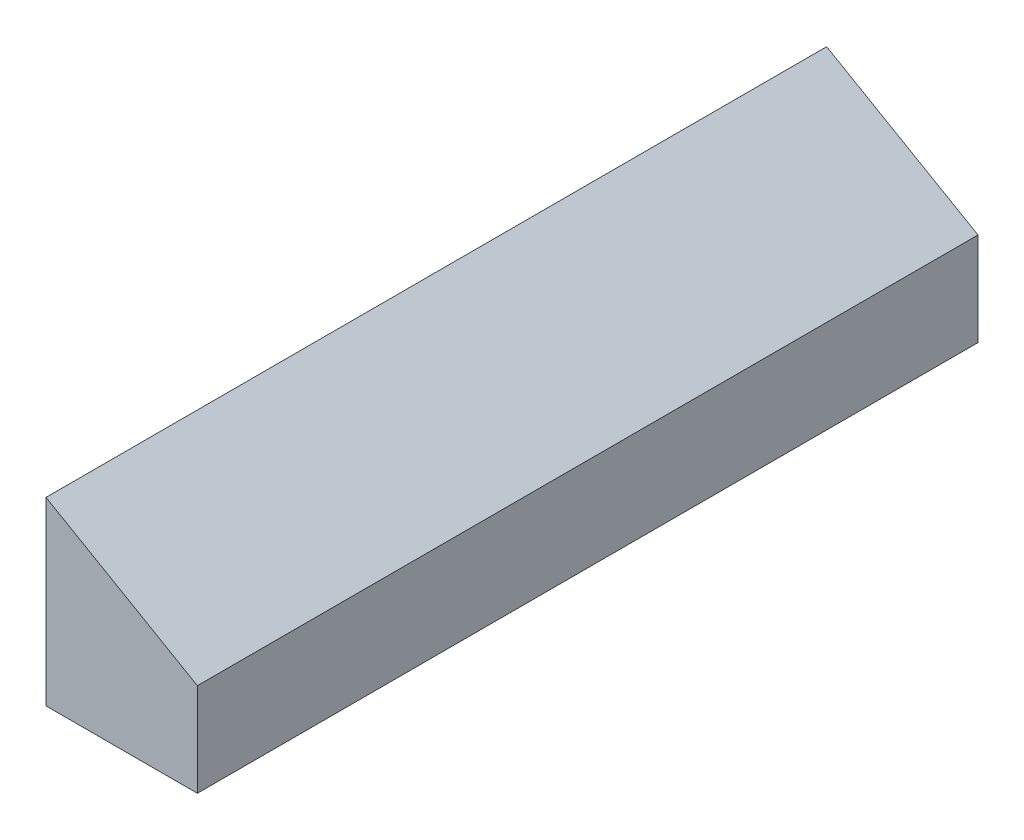
ISO-10303-21;
HEADER;
FILE_DESCRIPTION(('STEP AP214'),'2;1');
FILE_NAME('part.step','',(''),(''),'','','');
FILE_SCHEMA(('AUTOMOTIVE_DESIGN { 1 0 10303 214 1 1 1 1 }'));
ENDSEC;
DATA;
#1=APPLICATION_CONTEXT('core data for automotive mechanical design processes');
#2=APPLICATION_PROTOCOL_DEFINITION('international standard','automotive_design',2000,#1);
#3=PRODUCT_CONTEXT('',#1,'mechanical');
#4=PRODUCT('Part','Part','',(#3));
#5=PRODUCT_RELATED_PRODUCT_CATEGORY('part','',(#4));
#6=PRODUCT_DEFINITION_FORMATION('','',#4);
#7=PRODUCT_DEFINITION_CONTEXT('part definition',#1,'design');
#8=PRODUCT_DEFINITION('design','',#6,#7);
#9=PRODUCT_DEFINITION_SHAPE('','',#8);
#10=(LENGTH_UNIT() NAMED_UNIT(*) SI_UNIT(.MILLI.,.METRE.));
#11=(NAMED_UNIT(*) PLANE_ANGLE_UNIT() SI_UNIT($,.RADIAN.));
#12=(NAMED_UNIT(*) SI_UNIT($,.STERADIAN.) SOLID_ANGLE_UNIT());
#13=UNCERTAINTY_MEASURE_WITH_UNIT(LENGTH_MEASURE(1.E-05),#10,'distance_accuracy_value','');
#14=(GEOMETRIC_REPRESENTATION_CONTEXT(3) GLOBAL_UNCERTAINTY_ASSIGNED_CONTEXT((#13)) GLOBAL_UNIT_ASSIGNED_CONTEXT((#10,
#11,#12)) REPRESENTATION_CONTEXT('',''));
#15=CARTESIAN_POINT('',(0.,0.,0.));
#16=DIRECTION('',(0.,0.,1.));
#17=DIRECTION('',(1.,0.,0.));
#18=AXIS2_PLACEMENT_3D('',#15,#16,#17);
#19=CARTESIAN_POINT('',(0.,0.,67.));
#20=DIRECTION('',(0.,1.,0.));
#21=DIRECTION('',(0.,0.,1.));
#22=AXIS2_PLACEMENT_3D('',#19,#20,#21);
#23=PLANE('',#22);
#24=DIRECTION('',(1.,0.,0.));
#25=VECTOR('',#24,1.);
#26=CARTESIAN_POINT('',(0.,0.,0.));
#27=LINE('',#26,#25);
#28=CARTESIAN_POINT('',(0.,0.,0.));
#29=VERTEX_POINT('',#28);
#30=CARTESIAN_POINT('',(12.9903810567667,0.,0.));
#31=VERTEX_POINT('',#30);
#32=EDGE_CURVE('E107',#29,#31,#27,.T.);
#33=ORIENTED_EDGE('',*,*,#32,.T.);
#34=DIRECTION('',(0.,0.,-1.));
#35=VECTOR('',#34,1.);
#36=CARTESIAN_POINT('',(12.9903810567667,0.,67.));
#37=LINE('',#36,#35);
#38=CARTESIAN_POINT('',(12.9903810567667,0.,67.));
#39=VERTEX_POINT('',#38);
#40=EDGE_CURVE('E11',#39,#31,#37,.T.);
#41=ORIENTED_EDGE('',*,*,#40,.F.);
#42=DIRECTION('',(1.,0.,0.));
#43=VECTOR('',#42,1.);
#44=CARTESIAN_POINT('',(0.,0.,67.));
#45=LINE('',#44,#43);
#46=CARTESIAN_POINT('',(0.,0.,67.));
#47=VERTEX_POINT('',#46);
#48=EDGE_CURVE('E91',#47,#39,#45,.T.);
#49=ORIENTED_EDGE('',*,*,#48,.F.);
#50=DIRECTION('',(0.,0.,-1.));
#51=VECTOR('',#50,1.);
#52=CARTESIAN_POINT('',(0.,0.,67.));
#53=LINE('',#52,#51);
#54=EDGE_CURVE('E103',#47,#29,#53,.T.);
#55=ORIENTED_EDGE('',*,*,#54,.T.);
#56=EDGE_LOOP('',(#33,#41,#49,#55));
#57=FACE_BOUND('',#56,.T.);
#58=ADVANCED_FACE('F39',(#57),#23,.F.);
#59=CARTESIAN_POINT('',(12.9903810567667,0.,67.));
#60=DIRECTION('',(-1.,0.,0.));
#61=DIRECTION('',(0.,-1.,0.));
#62=AXIS2_PLACEMENT_3D('',#59,#60,#61);
#63=PLANE('',#62);
#64=DIRECTION('',(0.,1.,0.));
#65=VECTOR('',#64,1.);
#66=CARTESIAN_POINT('',(12.9903810567667,0.,0.));
#67=LINE('',#66,#65);
#68=CARTESIAN_POINT('',(12.9903810567666,8.00000000000008,0.));
#69=VERTEX_POINT('',#68);
#70=EDGE_CURVE('E96',#31,#69,#67,.T.);
#71=ORIENTED_EDGE('',*,*,#70,.T.);
#72=DIRECTION('',(0.,0.,-1.));
#73=VECTOR('',#72,1.);
#74=CARTESIAN_POINT('',(12.9903810567666,8.00000000000008,67.));
#75=LINE('',#74,#73);
#76=CARTESIAN_POINT('',(12.9903810567666,8.00000000000008,67.));
#77=VERTEX_POINT('',#76);
#78=EDGE_CURVE('E48',#77,#69,#75,.T.);
#79=ORIENTED_EDGE('',*,*,#78,.F.);
#80=DIRECTION('',(0.,1.,0.));
#81=VECTOR('',#80,1.);
#82=CARTESIAN_POINT('',(12.9903810567667,0.,67.));
#83=LINE('',#82,#81);
#84=EDGE_CURVE('E86',#39,#77,#83,.T.);
#85=ORIENTED_EDGE('',*,*,#84,.F.);
#86=ORIENTED_EDGE('',*,*,#40,.T.);
#87=EDGE_LOOP('',(#71,#79,#85,#86));
#88=FACE_BOUND('',#87,.T.);
#89=ADVANCED_FACE('F95',(#88),#63,.F.);
#90=CARTESIAN_POINT('',(0.,15.5,67.));
#91=DIRECTION('',(-0.499999999999992,-0.866025403784443,0.));
#92=DIRECTION('',(0.866025403784443,-0.499999999999992,0.));
#93=AXIS2_PLACEMENT_3D('',#90,#91,#92);
#94=PLANE('',#93);
#95=DIRECTION('',(-0.866025403784443,0.499999999999992,0.));
#96=VECTOR('',#95,1.);
#97=CARTESIAN_POINT('',(0.,15.5,0.));
#98=LINE('',#97,#96);
#99=CARTESIAN_POINT('',(0.,15.5,0.));
#100=VERTEX_POINT('',#99);
#101=EDGE_CURVE('E73',#69,#100,#98,.T.);
#102=ORIENTED_EDGE('',*,*,#101,.T.);
#103=DIRECTION('',(0.,0.,-1.));
#104=VECTOR('',#103,1.);
#105=CARTESIAN_POINT('',(0.,15.5,67.));
#106=LINE('',#105,#104);
#107=CARTESIAN_POINT('',(0.,15.5,67.));
#108=VERTEX_POINT('',#107);
#109=EDGE_CURVE('E98',#108,#100,#106,.T.);
#110=ORIENTED_EDGE('',*,*,#109,.F.);
#111=DIRECTION('',(-0.866025403784443,0.499999999999992,0.));
#112=VECTOR('',#111,1.);
#113=CARTESIAN_POINT('',(0.,15.5,67.));
#114=LINE('',#113,#112);
#115=EDGE_CURVE('E89',#77,#108,#114,.T.);
#116=ORIENTED_EDGE('',*,*,#115,.F.);
#117=ORIENTED_EDGE('',*,*,#78,.T.);
#118=EDGE_LOOP('',(#102,#110,#116,#117));
#119=FACE_BOUND('',#118,.T.);
#120=ADVANCED_FACE('F99',(#119),#94,.F.);
#121=CARTESIAN_POINT('',(0.,0.,67.));
#122=DIRECTION('',(1.,0.,0.));
#123=DIRECTION('',(0.,1.,0.));
#124=AXIS2_PLACEMENT_3D('',#121,#122,#123);
#125=PLANE('',#124);
#126=DIRECTION('',(0.,-1.,0.));
#127=VECTOR('',#126,1.);
#128=CARTESIAN_POINT('',(0.,0.,0.));
#129=LINE('',#128,#127);
#130=EDGE_CURVE('E79',#100,#29,#129,.T.);
#131=ORIENTED_EDGE('',*,*,#130,.T.);
#132=ORIENTED_EDGE('',*,*,#54,.F.);
#133=DIRECTION('',(0.,-1.,0.));
#134=VECTOR('',#133,1.);
#135=CARTESIAN_POINT('',(0.,0.,67.));
#136=LINE('',#135,#134);
#137=EDGE_CURVE('E56',#108,#47,#136,.T.);
#138=ORIENTED_EDGE('',*,*,#137,.F.);
#139=ORIENTED_EDGE('',*,*,#109,.T.);
#140=EDGE_LOOP('',(#131,#132,#138,#139));
#141=FACE_BOUND('',#140,.T.);
#142=ADVANCED_FACE('F120',(#141),#125,.F.);
#143=CARTESIAN_POINT('',(0.,0.,67.));
#144=DIRECTION('',(0.,0.,1.));
#145=DIRECTION('',(1.,0.,0.));
#146=AXIS2_PLACEMENT_3D('',#143,#144,#145);
#147=PLANE('',#146);
#148=ORIENTED_EDGE('',*,*,#48,.T.);
#149=ORIENTED_EDGE('',*,*,#84,.T.);
#150=ORIENTED_EDGE('',*,*,#115,.T.);
#151=ORIENTED_EDGE('',*,*,#137,.T.);
#152=EDGE_LOOP('',(#148,#149,#150,#151));
#153=FACE_BOUND('',#152,.T.);
#154=ADVANCED_FACE('F87',(#153),#147,.T.);
#155=CARTESIAN_POINT('',(0.,0.,0.));
#156=DIRECTION('',(0.,0.,1.));
#157=DIRECTION('',(1.,0.,0.));
#158=AXIS2_PLACEMENT_3D('',#155,#156,#157);
#159=PLANE('',#158);
#160=ORIENTED_EDGE('',*,*,#32,.F.);
#161=ORIENTED_EDGE('',*,*,#130,.F.);
#162=ORIENTED_EDGE('',*,*,#101,.F.);
#163=ORIENTED_EDGE('',*,*,#70,.F.);
#164=EDGE_LOOP('',(#160,#161,#162,#163));
#165=FACE_BOUND('',#164,.T.);
#166=ADVANCED_FACE('F123',(#165),#159,.F.);
#167=CLOSED_SHELL('',(#58,#89,#120,#142,#154,#166));
#168=MANIFOLD_SOLID_BREP('B2',#167);
#169=ADVANCED_BREP_SHAPE_REPRESENTATION('',(#18,#168),#14);
#170=SHAPE_DEFINITION_REPRESENTATION(#9,#169);
ENDSEC;
END-ISO-10303-21;
